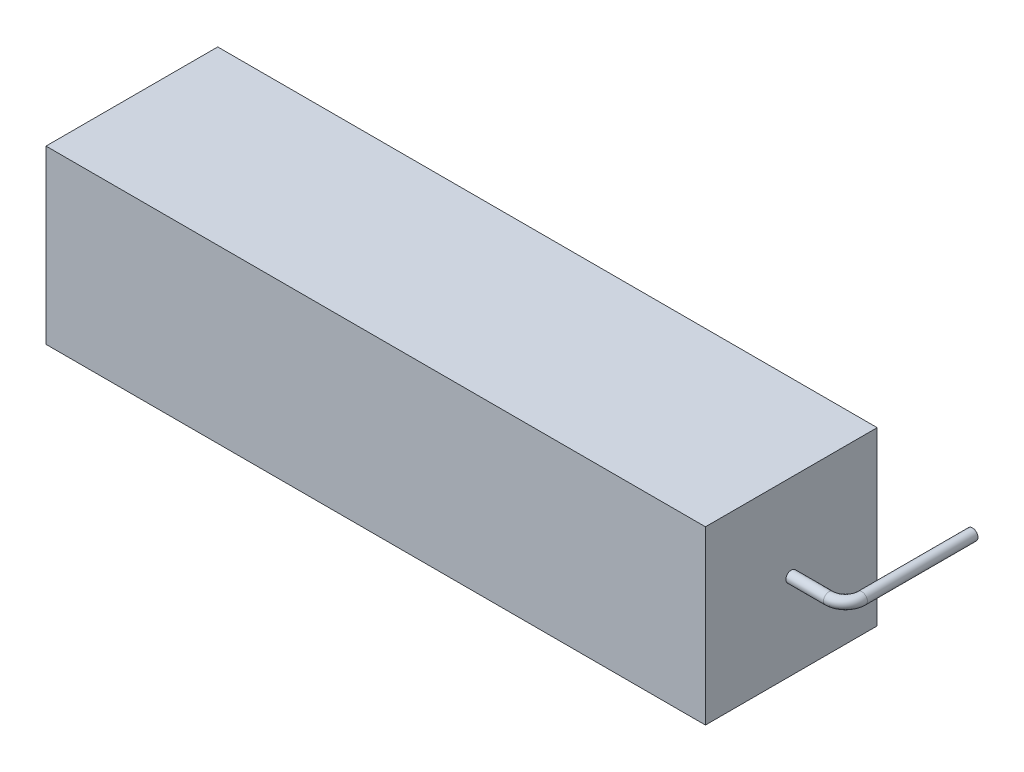
ISO-10303-21;
HEADER;
FILE_DESCRIPTION(('STEP AP214'),'2;1');
FILE_NAME('part.step','',(''),(''),'','','');
FILE_SCHEMA(('AUTOMOTIVE_DESIGN { 1 0 10303 214 1 1 1 1 }'));
ENDSEC;
DATA;
#1=APPLICATION_CONTEXT('core data for automotive mechanical design processes');
#2=APPLICATION_PROTOCOL_DEFINITION('international standard','automotive_design',2000,#1);
#3=PRODUCT_CONTEXT('',#1,'mechanical');
#4=PRODUCT('Part','Part','',(#3));
#5=PRODUCT_RELATED_PRODUCT_CATEGORY('part','',(#4));
#6=PRODUCT_DEFINITION_FORMATION('','',#4);
#7=PRODUCT_DEFINITION_CONTEXT('part definition',#1,'design');
#8=PRODUCT_DEFINITION('design','',#6,#7);
#9=PRODUCT_DEFINITION_SHAPE('','',#8);
#10=(LENGTH_UNIT() NAMED_UNIT(*) SI_UNIT(.MILLI.,.METRE.));
#11=(NAMED_UNIT(*) PLANE_ANGLE_UNIT() SI_UNIT($,.RADIAN.));
#12=(NAMED_UNIT(*) SI_UNIT($,.STERADIAN.) SOLID_ANGLE_UNIT());
#13=UNCERTAINTY_MEASURE_WITH_UNIT(LENGTH_MEASURE(1.E-05),#10,'distance_accuracy_value','');
#14=(GEOMETRIC_REPRESENTATION_CONTEXT(3) GLOBAL_UNCERTAINTY_ASSIGNED_CONTEXT((#13)) GLOBAL_UNIT_ASSIGNED_CONTEXT((#10,
#11,#12)) REPRESENTATION_CONTEXT('',''));
#15=CARTESIAN_POINT('',(0.,0.,0.));
#16=DIRECTION('',(0.,0.,1.));
#17=DIRECTION('',(1.,0.,0.));
#18=AXIS2_PLACEMENT_3D('',#15,#16,#17);
#19=CARTESIAN_POINT('',(55.48,0.,-3.));
#20=DIRECTION('',(0.,0.,1.));
#21=DIRECTION('',(1.,0.,0.));
#22=AXIS2_PLACEMENT_3D('',#19,#20,#21);
#23=PLANE('',#22);
#24=CARTESIAN_POINT('',(55.88,0.,-3.));
#25=DIRECTION('',(0.,0.,-1.));
#26=DIRECTION('',(-1.,0.,0.));
#27=AXIS2_PLACEMENT_3D('',#24,#25,#26);
#28=CIRCLE('',#27,0.4);
#29=CARTESIAN_POINT('',(55.48,0.,-3.));
#30=VERTEX_POINT('',#29);
#31=EDGE_CURVE('E20',#30,#30,#28,.F.);
#32=ORIENTED_EDGE('',*,*,#31,.F.);
#33=EDGE_LOOP('',(#32));
#34=FACE_BOUND('',#33,.T.);
#35=ADVANCED_FACE('F17',(#34),#23,.F.);
#36=CARTESIAN_POINT('',(0.4,0.,-3.));
#37=DIRECTION('',(0.,0.,-1.));
#38=DIRECTION('',(-1.,0.,0.));
#39=AXIS2_PLACEMENT_3D('',#36,#37,#38);
#40=PLANE('',#39);
#41=CARTESIAN_POINT('',(0.,0.,-3.));
#42=DIRECTION('',(0.,0.,1.));
#43=DIRECTION('',(1.,0.,0.));
#44=AXIS2_PLACEMENT_3D('',#41,#42,#43);
#45=CIRCLE('',#44,0.4);
#46=CARTESIAN_POINT('',(0.4,0.,-3.));
#47=VERTEX_POINT('',#46);
#48=EDGE_CURVE('E110',#47,#47,#45,.T.);
#49=ORIENTED_EDGE('',*,*,#48,.F.);
#50=EDGE_LOOP('',(#49));
#51=FACE_BOUND('',#50,.T.);
#52=ADVANCED_FACE('F125',(#51),#40,.T.);
#53=CARTESIAN_POINT('',(55.88,0.,5.05));
#54=DIRECTION('',(0.,0.,-1.));
#55=DIRECTION('',(-1.,0.,0.));
#56=AXIS2_PLACEMENT_3D('',#53,#54,#55);
#57=CYLINDRICAL_SURFACE('',#56,0.4);
#58=ORIENTED_EDGE('',*,*,#31,.T.);
#59=EDGE_LOOP('',(#58));
#60=FACE_BOUND('',#59,.T.);
#61=CARTESIAN_POINT('',(55.88,0.,5.05));
#62=DIRECTION('',(0.,0.,-1.));
#63=DIRECTION('',(1.,0.,0.));
#64=AXIS2_PLACEMENT_3D('',#61,#62,#63);
#65=CIRCLE('',#64,0.4);
#66=CARTESIAN_POINT('',(56.28,0.,5.05));
#67=VERTEX_POINT('',#66);
#68=EDGE_CURVE('E107',#67,#67,#65,.F.);
#69=ORIENTED_EDGE('',*,*,#68,.F.);
#70=EDGE_LOOP('',(#69));
#71=FACE_BOUND('',#70,.T.);
#72=ADVANCED_FACE('F121',(#60,#71),#57,.T.);
#73=CARTESIAN_POINT('',(0.,0.,-3.));
#74=DIRECTION('',(0.,0.,1.));
#75=DIRECTION('',(1.,0.,0.));
#76=AXIS2_PLACEMENT_3D('',#73,#74,#75);
#77=CYLINDRICAL_SURFACE('',#76,0.4);
#78=CARTESIAN_POINT('',(0.,0.,5.05));
#79=DIRECTION('',(0.,0.,1.));
#80=DIRECTION('',(-1.,0.,0.));
#81=AXIS2_PLACEMENT_3D('',#78,#79,#80);
#82=CIRCLE('',#81,0.4);
#83=CARTESIAN_POINT('',(-0.4,0.,5.05));
#84=VERTEX_POINT('',#83);
#85=EDGE_CURVE('E87',#84,#84,#82,.T.);
#86=ORIENTED_EDGE('',*,*,#85,.F.);
#87=EDGE_LOOP('',(#86));
#88=FACE_BOUND('',#87,.T.);
#89=ORIENTED_EDGE('',*,*,#48,.T.);
#90=EDGE_LOOP('',(#89));
#91=FACE_BOUND('',#90,.T.);
#92=ADVANCED_FACE('F102',(#88,#91),#77,.T.);
#93=CARTESIAN_POINT('',(54.68,0.,5.05));
#94=DIRECTION('',(0.,1.,0.));
#95=DIRECTION('',(0.,0.,1.));
#96=AXIS2_PLACEMENT_3D('',#93,#94,#95);
#97=TOROIDAL_SURFACE('',#96,1.2,0.4);
#98=ORIENTED_EDGE('',*,*,#68,.T.);
#99=EDGE_LOOP('',(#98));
#100=FACE_BOUND('',#99,.T.);
#101=CARTESIAN_POINT('',(54.68,0.,6.25));
#102=DIRECTION('',(1.,0.,0.));
#103=DIRECTION('',(0.,0.,-1.));
#104=AXIS2_PLACEMENT_3D('',#101,#102,#103);
#105=CIRCLE('',#104,0.4);
#106=CARTESIAN_POINT('',(54.68,0.,5.85));
#107=VERTEX_POINT('',#106);
#108=EDGE_CURVE('E84',#107,#107,#105,.F.);
#109=ORIENTED_EDGE('',*,*,#108,.F.);
#110=EDGE_LOOP('',(#109));
#111=FACE_BOUND('',#110,.T.);
#112=ADVANCED_FACE('F97',(#100,#111),#97,.T.);
#113=CARTESIAN_POINT('',(1.2,0.,5.05));
#114=DIRECTION('',(0.,1.,0.));
#115=DIRECTION('',(-1.,0.,0.));
#116=AXIS2_PLACEMENT_3D('',#113,#114,#115);
#117=TOROIDAL_SURFACE('',#116,1.2,0.4);
#118=CARTESIAN_POINT('',(1.2,0.,6.25));
#119=DIRECTION('',(1.,0.,0.));
#120=DIRECTION('',(0.,0.,-1.));
#121=AXIS2_PLACEMENT_3D('',#118,#119,#120);
#122=CIRCLE('',#121,0.4);
#123=CARTESIAN_POINT('',(1.2,0.,5.85));
#124=VERTEX_POINT('',#123);
#125=EDGE_CURVE('E66',#124,#124,#122,.T.);
#126=ORIENTED_EDGE('',*,*,#125,.F.);
#127=EDGE_LOOP('',(#126));
#128=FACE_BOUND('',#127,.T.);
#129=ORIENTED_EDGE('',*,*,#85,.T.);
#130=EDGE_LOOP('',(#129));
#131=FACE_BOUND('',#130,.T.);
#132=ADVANCED_FACE('F92',(#128,#131),#117,.T.);
#133=CARTESIAN_POINT('',(1.2,0.,6.25));
#134=DIRECTION('',(1.,0.,0.));
#135=DIRECTION('',(0.,0.,-1.));
#136=AXIS2_PLACEMENT_3D('',#133,#134,#135);
#137=CYLINDRICAL_SURFACE('',#136,0.4);
#138=ORIENTED_EDGE('',*,*,#108,.T.);
#139=EDGE_LOOP('',(#138));
#140=FACE_BOUND('',#139,.T.);
#141=CARTESIAN_POINT('',(51.94,0.,6.25));
#142=DIRECTION('',(1.,0.,0.));
#143=DIRECTION('',(0.,0.,-1.));
#144=AXIS2_PLACEMENT_3D('',#141,#142,#143);
#145=CIRCLE('',#144,0.4);
#146=CARTESIAN_POINT('',(51.94,0.,5.85));
#147=VERTEX_POINT('',#146);
#148=EDGE_CURVE('E74',#147,#147,#145,.T.);
#149=ORIENTED_EDGE('',*,*,#148,.T.);
#150=EDGE_LOOP('',(#149));
#151=FACE_BOUND('',#150,.T.);
#152=ADVANCED_FACE('F96',(#140,#151),#137,.T.);
#153=CARTESIAN_POINT('',(3.94,6.25,12.5));
#154=DIRECTION('',(0.,0.,-1.));
#155=DIRECTION('',(-1.,0.,0.));
#156=AXIS2_PLACEMENT_3D('',#153,#154,#155);
#157=PLANE('',#156);
#158=DIRECTION('',(1.,0.,0.));
#159=VECTOR('',#158,1.);
#160=CARTESIAN_POINT('',(3.94,-6.25,12.5));
#161=LINE('',#160,#159);
#162=CARTESIAN_POINT('',(3.94,-6.25,12.5));
#163=VERTEX_POINT('',#162);
#164=CARTESIAN_POINT('',(51.94,-6.25,12.5));
#165=VERTEX_POINT('',#164);
#166=EDGE_CURVE('E58',#163,#165,#161,.T.);
#167=ORIENTED_EDGE('',*,*,#166,.T.);
#168=DIRECTION('',(0.,1.,0.));
#169=VECTOR('',#168,1.);
#170=CARTESIAN_POINT('',(51.94,-6.25,12.5));
#171=LINE('',#170,#169);
#172=CARTESIAN_POINT('',(51.94,6.25,12.5));
#173=VERTEX_POINT('',#172);
#174=EDGE_CURVE('E55',#165,#173,#171,.T.);
#175=ORIENTED_EDGE('',*,*,#174,.T.);
#176=DIRECTION('',(1.,0.,0.));
#177=VECTOR('',#176,1.);
#178=CARTESIAN_POINT('',(3.94,6.25,12.5));
#179=LINE('',#178,#177);
#180=CARTESIAN_POINT('',(3.94,6.25,12.5));
#181=VERTEX_POINT('',#180);
#182=EDGE_CURVE('E299',#173,#181,#179,.F.);
#183=ORIENTED_EDGE('',*,*,#182,.T.);
#184=DIRECTION('',(0.,1.,0.));
#185=VECTOR('',#184,1.);
#186=CARTESIAN_POINT('',(3.94,-6.25,12.5));
#187=LINE('',#186,#185);
#188=EDGE_CURVE('E60',#163,#181,#187,.T.);
#189=ORIENTED_EDGE('',*,*,#188,.F.);
#190=EDGE_LOOP('',(#167,#175,#183,#189));
#191=FACE_BOUND('',#190,.T.);
#192=ADVANCED_FACE('F59',(#191),#157,.F.);
#193=CARTESIAN_POINT('',(1.2,0.,6.25));
#194=DIRECTION('',(1.,0.,0.));
#195=DIRECTION('',(0.,0.,-1.));
#196=AXIS2_PLACEMENT_3D('',#193,#194,#195);
#197=CYLINDRICAL_SURFACE('',#196,0.4);
#198=CARTESIAN_POINT('',(3.94,0.,6.25));
#199=DIRECTION('',(1.,0.,0.));
#200=DIRECTION('',(0.,0.,-1.));
#201=AXIS2_PLACEMENT_3D('',#198,#199,#200);
#202=CIRCLE('',#201,0.4);
#203=CARTESIAN_POINT('',(3.94,0.,5.85));
#204=VERTEX_POINT('',#203);
#205=EDGE_CURVE('E111',#204,#204,#202,.T.);
#206=ORIENTED_EDGE('',*,*,#205,.F.);
#207=EDGE_LOOP('',(#206));
#208=FACE_BOUND('',#207,.T.);
#209=ORIENTED_EDGE('',*,*,#125,.T.);
#210=EDGE_LOOP('',(#209));
#211=FACE_BOUND('',#210,.T.);
#212=ADVANCED_FACE('F152',(#208,#211),#197,.T.);
#213=CARTESIAN_POINT('',(3.94,-6.25,12.5));
#214=DIRECTION('',(0.,1.,0.));
#215=DIRECTION('',(0.,0.,1.));
#216=AXIS2_PLACEMENT_3D('',#213,#214,#215);
#217=PLANE('',#216);
#218=DIRECTION('',(1.,0.,0.));
#219=VECTOR('',#218,1.);
#220=CARTESIAN_POINT('',(3.94,-6.25,0.));
#221=LINE('',#220,#219);
#222=CARTESIAN_POINT('',(3.94,-6.25,0.));
#223=VERTEX_POINT('',#222);
#224=CARTESIAN_POINT('',(51.94,-6.25,0.));
#225=VERTEX_POINT('',#224);
#226=EDGE_CURVE('E78',#223,#225,#221,.T.);
#227=ORIENTED_EDGE('',*,*,#226,.T.);
#228=DIRECTION('',(0.,0.,1.));
#229=VECTOR('',#228,1.);
#230=CARTESIAN_POINT('',(51.94,-6.25,0.));
#231=LINE('',#230,#229);
#232=EDGE_CURVE('E65',#225,#165,#231,.T.);
#233=ORIENTED_EDGE('',*,*,#232,.T.);
#234=ORIENTED_EDGE('',*,*,#166,.F.);
#235=DIRECTION('',(0.,0.,1.));
#236=VECTOR('',#235,1.);
#237=CARTESIAN_POINT('',(3.94,-6.25,0.));
#238=LINE('',#237,#236);
#239=EDGE_CURVE('E297',#223,#163,#238,.T.);
#240=ORIENTED_EDGE('',*,*,#239,.F.);
#241=EDGE_LOOP('',(#227,#233,#234,#240));
#242=FACE_BOUND('',#241,.T.);
#243=ADVANCED_FACE('F77',(#242),#217,.F.);
#244=CARTESIAN_POINT('',(51.94,-6.25,0.));
#245=DIRECTION('',(-1.,0.,0.));
#246=DIRECTION('',(0.,0.,1.));
#247=AXIS2_PLACEMENT_3D('',#244,#245,#246);
#248=PLANE('',#247);
#249=ORIENTED_EDGE('',*,*,#148,.F.);
#250=EDGE_LOOP('',(#249));
#251=FACE_BOUND('',#250,.T.);
#252=ORIENTED_EDGE('',*,*,#174,.F.);
#253=ORIENTED_EDGE('',*,*,#232,.F.);
#254=DIRECTION('',(0.,1.,0.));
#255=VECTOR('',#254,1.);
#256=CARTESIAN_POINT('',(51.94,-6.25,0.));
#257=LINE('',#256,#255);
#258=CARTESIAN_POINT('',(51.94,6.25,0.));
#259=VERTEX_POINT('',#258);
#260=EDGE_CURVE('E306',#225,#259,#257,.T.);
#261=ORIENTED_EDGE('',*,*,#260,.T.);
#262=DIRECTION('',(0.,0.,-1.));
#263=VECTOR('',#262,1.);
#264=CARTESIAN_POINT('',(51.94,6.25,0.));
#265=LINE('',#264,#263);
#266=EDGE_CURVE('E73',#259,#173,#265,.F.);
#267=ORIENTED_EDGE('',*,*,#266,.T.);
#268=EDGE_LOOP('',(#252,#253,#261,#267));
#269=FACE_BOUND('',#268,.T.);
#270=ADVANCED_FACE('F70',(#251,#269),#248,.F.);
#271=CARTESIAN_POINT('',(3.94,6.25,0.));
#272=DIRECTION('',(0.,-1.,0.));
#273=DIRECTION('',(0.,0.,-1.));
#274=AXIS2_PLACEMENT_3D('',#271,#272,#273);
#275=PLANE('',#274);
#276=ORIENTED_EDGE('',*,*,#182,.F.);
#277=ORIENTED_EDGE('',*,*,#266,.F.);
#278=DIRECTION('',(1.,0.,0.));
#279=VECTOR('',#278,1.);
#280=CARTESIAN_POINT('',(3.94,6.25,0.));
#281=LINE('',#280,#279);
#282=CARTESIAN_POINT('',(3.94,6.25,0.));
#283=VERTEX_POINT('',#282);
#284=EDGE_CURVE('E26',#259,#283,#281,.F.);
#285=ORIENTED_EDGE('',*,*,#284,.T.);
#286=DIRECTION('',(0.,0.,1.));
#287=VECTOR('',#286,1.);
#288=CARTESIAN_POINT('',(3.94,6.25,0.));
#289=LINE('',#288,#287);
#290=EDGE_CURVE('E34',#181,#283,#289,.F.);
#291=ORIENTED_EDGE('',*,*,#290,.F.);
#292=EDGE_LOOP('',(#276,#277,#285,#291));
#293=FACE_BOUND('',#292,.T.);
#294=ADVANCED_FACE('F139',(#293),#275,.F.);
#295=CARTESIAN_POINT('',(3.94,-6.25,0.));
#296=DIRECTION('',(-1.,0.,0.));
#297=DIRECTION('',(0.,0.,1.));
#298=AXIS2_PLACEMENT_3D('',#295,#296,#297);
#299=PLANE('',#298);
#300=ORIENTED_EDGE('',*,*,#205,.T.);
#301=EDGE_LOOP('',(#300));
#302=FACE_BOUND('',#301,.T.);
#303=ORIENTED_EDGE('',*,*,#188,.T.);
#304=ORIENTED_EDGE('',*,*,#290,.T.);
#305=DIRECTION('',(0.,1.,0.));
#306=VECTOR('',#305,1.);
#307=CARTESIAN_POINT('',(3.94,-6.25,0.));
#308=LINE('',#307,#306);
#309=EDGE_CURVE('E11',#283,#223,#308,.F.);
#310=ORIENTED_EDGE('',*,*,#309,.T.);
#311=ORIENTED_EDGE('',*,*,#239,.T.);
#312=EDGE_LOOP('',(#303,#304,#310,#311));
#313=FACE_BOUND('',#312,.T.);
#314=ADVANCED_FACE('F133',(#302,#313),#299,.T.);
#315=CARTESIAN_POINT('',(3.94,-6.25,0.));
#316=DIRECTION('',(0.,0.,1.));
#317=DIRECTION('',(1.,0.,0.));
#318=AXIS2_PLACEMENT_3D('',#315,#316,#317);
#319=PLANE('',#318);
#320=ORIENTED_EDGE('',*,*,#284,.F.);
#321=ORIENTED_EDGE('',*,*,#260,.F.);
#322=ORIENTED_EDGE('',*,*,#226,.F.);
#323=ORIENTED_EDGE('',*,*,#309,.F.);
#324=EDGE_LOOP('',(#320,#321,#322,#323));
#325=FACE_BOUND('',#324,.T.);
#326=ADVANCED_FACE('F131',(#325),#319,.F.);
#327=CLOSED_SHELL('',(#35,#52,#72,#92,#112,#132,#152,#192,#212,#243,#270,#294,#314,#326));
#328=MANIFOLD_SOLID_BREP('B1',#327);
#329=ADVANCED_BREP_SHAPE_REPRESENTATION('',(#18,#328),#14);
#330=SHAPE_DEFINITION_REPRESENTATION(#9,#329);
ENDSEC;
END-ISO-10303-21;
